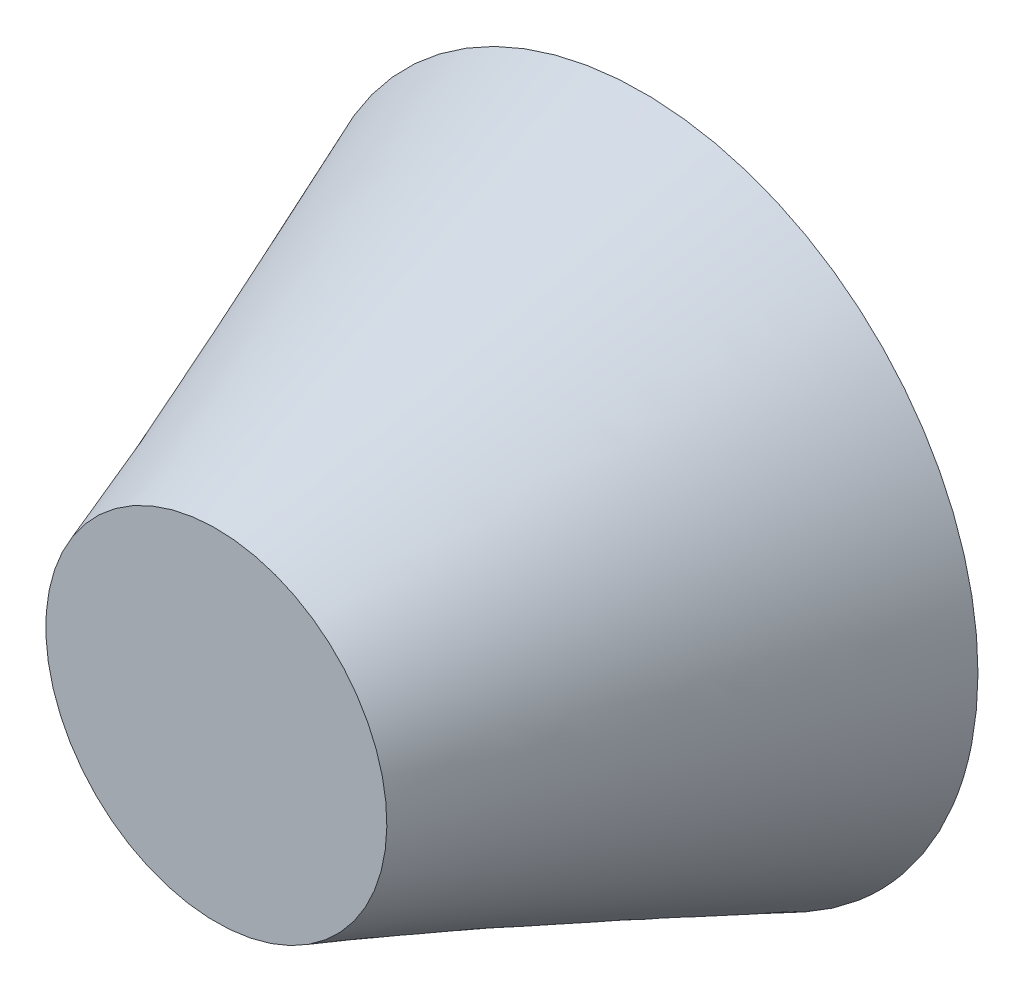
ISO-10303-21;
HEADER;
FILE_DESCRIPTION(('STEP AP214'),'2;1');
FILE_NAME('part.step','',(''),(''),'','','');
FILE_SCHEMA(('AUTOMOTIVE_DESIGN { 1 0 10303 214 1 1 1 1 }'));
ENDSEC;
DATA;
#1=APPLICATION_CONTEXT('core data for automotive mechanical design processes');
#2=APPLICATION_PROTOCOL_DEFINITION('international standard','automotive_design',2000,#1);
#3=PRODUCT_CONTEXT('',#1,'mechanical');
#4=PRODUCT('Part','Part','',(#3));
#5=PRODUCT_RELATED_PRODUCT_CATEGORY('part','',(#4));
#6=PRODUCT_DEFINITION_FORMATION('','',#4);
#7=PRODUCT_DEFINITION_CONTEXT('part definition',#1,'design');
#8=PRODUCT_DEFINITION('design','',#6,#7);
#9=PRODUCT_DEFINITION_SHAPE('','',#8);
#10=(LENGTH_UNIT() NAMED_UNIT(*) SI_UNIT(.MILLI.,.METRE.));
#11=(NAMED_UNIT(*) PLANE_ANGLE_UNIT() SI_UNIT($,.RADIAN.));
#12=(NAMED_UNIT(*) SI_UNIT($,.STERADIAN.) SOLID_ANGLE_UNIT());
#13=UNCERTAINTY_MEASURE_WITH_UNIT(LENGTH_MEASURE(1.E-05),#10,'distance_accuracy_value','');
#14=(GEOMETRIC_REPRESENTATION_CONTEXT(3) GLOBAL_UNCERTAINTY_ASSIGNED_CONTEXT((#13)) GLOBAL_UNIT_ASSIGNED_CONTEXT((#10,
#11,#12)) REPRESENTATION_CONTEXT('',''));
#15=CARTESIAN_POINT('',(0.,0.,0.));
#16=DIRECTION('',(0.,0.,1.));
#17=DIRECTION('',(1.,0.,0.));
#18=AXIS2_PLACEMENT_3D('',#15,#16,#17);
#19=CARTESIAN_POINT('',(0.,0.,0.));
#20=DIRECTION('',(0.,0.,1.));
#21=DIRECTION('',(1.,0.,0.));
#22=AXIS2_PLACEMENT_3D('',#19,#20,#21);
#23=PLANE('',#22);
#24=CARTESIAN_POINT('',(0.,0.,0.));
#25=DIRECTION('',(0.,0.,1.));
#26=DIRECTION('',(1.,0.,0.));
#27=AXIS2_PLACEMENT_3D('',#24,#25,#26);
#28=CIRCLE('',#27,10.3);
#29=CARTESIAN_POINT('',(10.3,0.,0.));
#30=VERTEX_POINT('',#29);
#31=EDGE_CURVE('E11',#30,#30,#28,.T.);
#32=ORIENTED_EDGE('',*,*,#31,.T.);
#33=EDGE_LOOP('',(#32));
#34=FACE_BOUND('',#33,.T.);
#35=CARTESIAN_POINT('',(0.,0.,0.));
#36=DIRECTION('',(0.,0.,1.));
#37=DIRECTION('',(1.,0.,0.));
#38=AXIS2_PLACEMENT_3D('',#35,#36,#37);
#39=CIRCLE('',#38,11.8);
#40=CARTESIAN_POINT('',(-10.1605280273572,6.00030584264583,0.));
#41=VERTEX_POINT('',#40);
#42=EDGE_CURVE('E45',#41,#41,#39,.T.);
#43=ORIENTED_EDGE('',*,*,#42,.F.);
#44=EDGE_LOOP('',(#43));
#45=FACE_BOUND('',#44,.T.);
#46=ADVANCED_FACE('F37',(#34,#45),#23,.F.);
#47=CARTESIAN_POINT('',(0.,0.,15.));
#48=DIRECTION('',(0.,0.,1.));
#49=DIRECTION('',(1.,0.,0.));
#50=AXIS2_PLACEMENT_3D('',#47,#48,#49);
#51=PLANE('',#50);
#52=CARTESIAN_POINT('',(0.,0.,15.));
#53=DIRECTION('',(0.,0.,1.));
#54=DIRECTION('',(1.,0.,0.));
#55=AXIS2_PLACEMENT_3D('',#52,#53,#54);
#56=CIRCLE('',#55,6.);
#57=CARTESIAN_POINT('',(-5.88212329880052,1.18348024812757,15.));
#58=VERTEX_POINT('',#57);
#59=EDGE_CURVE('E49',#58,#58,#56,.T.);
#60=ORIENTED_EDGE('',*,*,#59,.T.);
#61=EDGE_LOOP('',(#60));
#62=FACE_BOUND('',#61,.T.);
#63=ADVANCED_FACE('F71',(#62),#51,.T.);
#64=CARTESIAN_POINT('',(-5.88212329880052,1.18348024812757,15.));
#65=CARTESIAN_POINT('',(-10.1605280273572,6.00030584264583,0.));
#66=CARTESIAN_POINT('',(-3.51516280254537,12.9477268457286,15.));
#67=CARTESIAN_POINT('',(1.84008365793449,26.3213618973602,0.));
#68=CARTESIAN_POINT('',(8.24908379505567,10.5807663494735,15.));
#69=CARTESIAN_POINT('',(22.1611397126488,14.3207502120685,0.));
#70=CARTESIAN_POINT('',(5.88212329880052,-1.18348024812758,15.));
#71=CARTESIAN_POINT('',(10.1605280273572,-6.00030584264583,0.));
#72=CARTESIAN_POINT('',(3.51516280254537,-12.9477268457286,15.));
#73=CARTESIAN_POINT('',(-1.84008365793449,-26.3213618973602,0.));
#74=CARTESIAN_POINT('',(-8.24908379505568,-10.5807663494735,15.));
#75=CARTESIAN_POINT('',(-22.1611397126488,-14.3207502120685,0.));
#76=CARTESIAN_POINT('',(-5.88212329880052,1.18348024812757,15.));
#77=CARTESIAN_POINT('',(-10.1605280273572,6.00030584264583,0.));
#78=(BOUNDED_SURFACE() B_SPLINE_SURFACE(3,1,((#64,#65),(#66,#67),(#68,#69),(#70,#71),(#72,#73),
(#74,#75),(#76,#77)),.UNSPECIFIED.,.T.,.F.,.F.) B_SPLINE_SURFACE_WITH_KNOTS((4,3,4),(2,2),(0.,
0.5,1.),(0.,1.),.UNSPECIFIED.) GEOMETRIC_REPRESENTATION_ITEM() RATIONAL_B_SPLINE_SURFACE(((1.,
1.),(0.333333333333333,0.333333333333333),(0.333333333333333,0.333333333333333),(1.,1.),
(0.333333333333333,0.333333333333333),(0.333333333333333,0.333333333333333),(1.,1.))) REPRESENTATION_ITEM('') SURFACE());
#79=CARTESIAN_POINT('',(-5.88212329880052,1.18348024812757,15.));
#80=CARTESIAN_POINT('',(-5.92669001472298,1.23365551473714,14.84375));
#81=CARTESIAN_POINT('',(-5.97125673064545,1.2838307813467,14.6875));
#82=CARTESIAN_POINT('',(-6.06039016249038,1.38418131456583,14.375));
#83=CARTESIAN_POINT('',(-6.10495687841284,1.4343565811754,14.21875));
#84=CARTESIAN_POINT('',(-6.19409031025777,1.53470711439453,13.90625));
#85=CARTESIAN_POINT('',(-6.23865702618024,1.5848823810041,13.75));
#86=CARTESIAN_POINT('',(-6.32779045802517,1.68523291422323,13.4375));
#87=CARTESIAN_POINT('',(-6.37235717394763,1.73540818083279,13.28125));
#88=CARTESIAN_POINT('',(-6.46149060579256,1.83575871405192,12.96875));
#89=CARTESIAN_POINT('',(-6.50605732171503,1.88593398066149,12.8125));
#90=CARTESIAN_POINT('',(-6.59519075355996,1.98628451388062,12.5));
#91=CARTESIAN_POINT('',(-6.63975746948243,2.03645978049018,12.34375));
#92=CARTESIAN_POINT('',(-6.72889090132735,2.13681031370931,12.03125));
#93=CARTESIAN_POINT('',(-6.77345761724982,2.18698558031888,11.875));
#94=CARTESIAN_POINT('',(-6.86259104909475,2.28733611353801,11.5625));
#95=CARTESIAN_POINT('',(-6.90715776501722,2.33751138014757,11.40625));
#96=CARTESIAN_POINT('',(-6.99629119686215,2.4378619133667,11.09375));
#97=CARTESIAN_POINT('',(-7.04085791278461,2.48803717997627,10.9375));
#98=CARTESIAN_POINT('',(-7.12999134462954,2.5883877131954,10.625));
#99=CARTESIAN_POINT('',(-7.17455806055201,2.63856297980496,10.46875));
#100=CARTESIAN_POINT('',(-7.26369149239694,2.73891351302409,10.15625));
#101=CARTESIAN_POINT('',(-7.3082582083194,2.78908877963366,10.));
#102=CARTESIAN_POINT('',(-7.39739164016433,2.88943931285279,9.6875));
#103=CARTESIAN_POINT('',(-7.4419583560868,2.93961457946235,9.53125));
#104=CARTESIAN_POINT('',(-7.53109178793173,3.03996511268148,9.21875));
#105=CARTESIAN_POINT('',(-7.57565850385419,3.09014037929105,9.0625));
#106=CARTESIAN_POINT('',(-7.66479193569912,3.19049091251018,8.75));
#107=CARTESIAN_POINT('',(-7.70935865162159,3.24066617911974,8.59375));
#108=CARTESIAN_POINT('',(-7.79849208346652,3.34101671233887,8.28125));
#109=CARTESIAN_POINT('',(-7.84305879938898,3.39119197894844,8.125));
#110=CARTESIAN_POINT('',(-7.93219223123391,3.49154251216757,7.8125));
#111=CARTESIAN_POINT('',(-7.97675894715638,3.54171777877714,7.65625));
#112=CARTESIAN_POINT('',(-8.06589237900131,3.64206831199627,7.34375));
#113=CARTESIAN_POINT('',(-8.11045909492377,3.69224357860583,7.1875));
#114=CARTESIAN_POINT('',(-8.1995925267687,3.79259411182496,6.875));
#115=CARTESIAN_POINT('',(-8.24415924269117,3.84276937843453,6.71875));
#116=CARTESIAN_POINT('',(-8.3332926745361,3.94311991165366,6.40625));
#117=CARTESIAN_POINT('',(-8.37785939045856,3.99329517826322,6.25));
#118=CARTESIAN_POINT('',(-8.46699282230349,4.09364571148235,5.9375));
#119=CARTESIAN_POINT('',(-8.51155953822596,4.14382097809192,5.78125));
#120=CARTESIAN_POINT('',(-8.60069297007089,4.24417151131105,5.46875));
#121=CARTESIAN_POINT('',(-8.64525968599335,4.29434677792061,5.3125));
#122=CARTESIAN_POINT('',(-8.73439311783828,4.39469731113974,5.));
#123=CARTESIAN_POINT('',(-8.77895983376075,4.44487257774931,4.84375));
#124=CARTESIAN_POINT('',(-8.86809326560568,4.54522311096844,4.53125));
#125=CARTESIAN_POINT('',(-8.91265998152814,4.595398377578,4.375));
#126=CARTESIAN_POINT('',(-9.00179341337307,4.69574891079713,4.0625));
#127=CARTESIAN_POINT('',(-9.04636012929554,4.7459241774067,3.90625));
#128=CARTESIAN_POINT('',(-9.13549356114047,4.84627471062583,3.59375));
#129=CARTESIAN_POINT('',(-9.18006027706293,4.89644997723539,3.4375));
#130=CARTESIAN_POINT('',(-9.26919370890786,4.99680051045452,3.125));
#131=CARTESIAN_POINT('',(-9.31376042483033,5.04697577706409,2.96875));
#132=CARTESIAN_POINT('',(-9.40289385667526,5.14732631028322,2.65625));
#133=CARTESIAN_POINT('',(-9.44746057259772,5.19750157689278,2.5));
#134=CARTESIAN_POINT('',(-9.53659400444265,5.29785211011191,2.1875));
#135=CARTESIAN_POINT('',(-9.58116072036512,5.34802737672148,2.03125));
#136=CARTESIAN_POINT('',(-9.67029415221005,5.44837790994061,1.71875));
#137=CARTESIAN_POINT('',(-9.71486086813252,5.49855317655017,1.5625));
#138=CARTESIAN_POINT('',(-9.80399429997744,5.5989037097693,1.25));
#139=CARTESIAN_POINT('',(-9.84856101589991,5.64907897637887,1.09375));
#140=CARTESIAN_POINT('',(-9.93769444774484,5.749429509598,0.78125));
#141=CARTESIAN_POINT('',(-9.9822611636673,5.79960477620757,0.625));
#142=CARTESIAN_POINT('',(-10.0713945955122,5.89995530942669,0.3125));
#143=CARTESIAN_POINT('',(-10.1159613114347,5.95013057603626,0.15625));
#144=CARTESIAN_POINT('',(-10.1605280273572,6.00030584264583,0.));
#145=B_SPLINE_CURVE_WITH_KNOTS('',3,(#79,#80,#81,#82,#83,#84,#85,#86,#87,#88,#89,#90,#91,#92,
#93,#94,#95,#96,#97,#98,#99,#100,#101,#102,#103,#104,#105,#106,#107,#108,#109,#110,#111,#112,
#113,#114,#115,#116,#117,#118,#119,#120,#121,#122,#123,#124,#125,#126,#127,#128,#129,#130,#131,
#132,#133,#134,#135,#136,#137,#138,#139,#140,#141,#142,#143,#144),.UNSPECIFIED.,.F.,.F.,(4,2,2,
2,2,2,2,2,2,2,2,2,2,2,2,2,2,2,2,2,2,2,2,2,2,2,2,2,2,2,2,2,4),(0.,0.510157140915515,
1.02031428183103,1.53047142274654,2.04062856366206,2.55078570457757,3.06094284549308,
3.5710999864086,4.08125712732411,4.59141426823963,5.10157140915514,5.61172855007066,
6.12188569098617,6.63204283190168,7.1421999728172,7.65235711373271,8.16251425464823,
8.67267139556374,9.18282853647925,9.69298567739477,10.2031428183103,10.7132999592258,
11.2234571001413,11.7336142410568,12.2437713819723,12.7539285228879,13.2640856638034,
13.7742428047189,14.2843999456344,14.7945570865499,15.3047142274654,15.8148713683809,
16.3250285092965),.UNSPECIFIED.);
#146=EDGE_CURVE('BSEAM72',#58,#41,#145,.T.);
#147=ORIENTED_EDGE('',*,*,#59,.F.);
#148=ORIENTED_EDGE('',*,*,#42,.T.);
#149=ORIENTED_EDGE('',*,*,#146,.T.);
#150=ORIENTED_EDGE('',*,*,#146,.F.);
#151=EDGE_LOOP('',(#147,#149,#148,#150));
#152=FACE_BOUND('',#151,.T.);
#153=ADVANCED_FACE('F72',(#152),#78,.T.);
#154=CARTESIAN_POINT('',(0.,0.,0.5));
#155=DIRECTION('',(0.,0.,-1.));
#156=DIRECTION('',(-1.,0.,0.));
#157=AXIS2_PLACEMENT_3D('',#154,#155,#156);
#158=PLANE('',#157);
#159=CARTESIAN_POINT('',(0.,0.,0.5));
#160=DIRECTION('',(0.,0.,-1.));
#161=DIRECTION('',(-1.,0.,0.));
#162=AXIS2_PLACEMENT_3D('',#159,#160,#161);
#163=CIRCLE('',#162,9.8);
#164=CARTESIAN_POINT('',(-9.8,0.,0.5));
#165=VERTEX_POINT('',#164);
#166=EDGE_CURVE('E55',#165,#165,#163,.T.);
#167=ORIENTED_EDGE('',*,*,#166,.T.);
#168=EDGE_LOOP('',(#167));
#169=FACE_BOUND('',#168,.T.);
#170=ADVANCED_FACE('F78',(#169),#158,.T.);
#171=CARTESIAN_POINT('',(0.,0.,0.500000000000004));
#172=DIRECTION('',(0.,0.,-1.));
#173=DIRECTION('',(-1.,0.,0.));
#174=AXIS2_PLACEMENT_3D('',#171,#172,#173);
#175=CONICAL_SURFACE('',#174,9.8,0.785398163397452);
#176=ORIENTED_EDGE('',*,*,#31,.F.);
#177=EDGE_LOOP('',(#176));
#178=FACE_BOUND('',#177,.T.);
#179=ORIENTED_EDGE('',*,*,#166,.F.);
#180=EDGE_LOOP('',(#179));
#181=FACE_BOUND('',#180,.T.);
#182=ADVANCED_FACE('F40',(#178,#181),#175,.F.);
#183=CLOSED_SHELL('',(#46,#63,#153,#170,#182));
#184=MANIFOLD_SOLID_BREP('B2',#183);
#185=ADVANCED_BREP_SHAPE_REPRESENTATION('',(#18,#184),#14);
#186=SHAPE_DEFINITION_REPRESENTATION(#9,#185);
ENDSEC;
END-ISO-10303-21;
